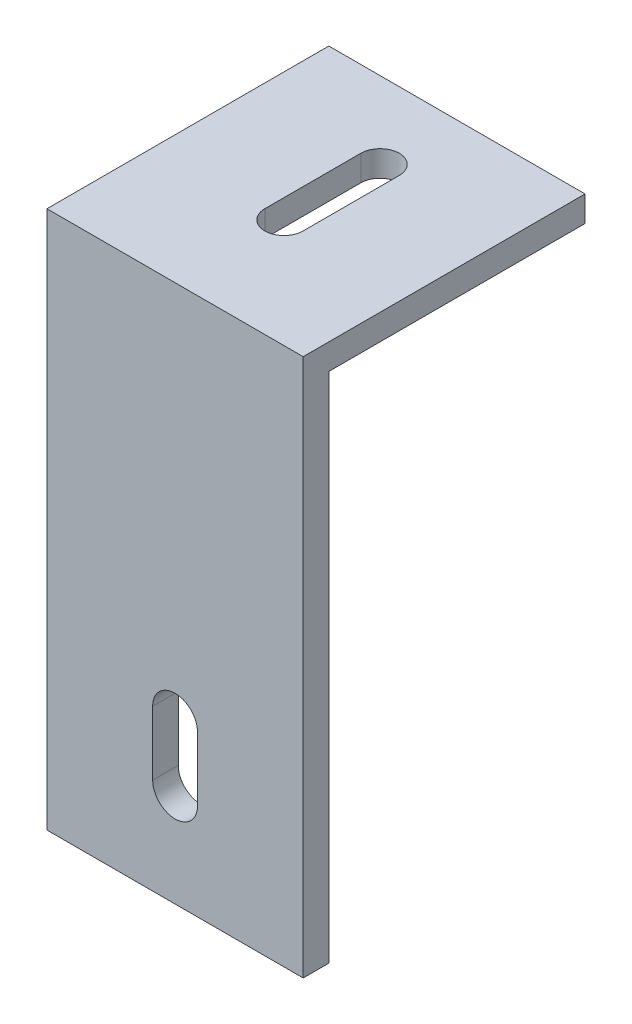
ISO-10303-21;
HEADER;
FILE_DESCRIPTION(('STEP AP214'),'2;1');
FILE_NAME('part.step','',(''),(''),'','','');
FILE_SCHEMA(('AUTOMOTIVE_DESIGN { 1 0 10303 214 1 1 1 1 }'));
ENDSEC;
DATA;
#1=APPLICATION_CONTEXT('core data for automotive mechanical design processes');
#2=APPLICATION_PROTOCOL_DEFINITION('international standard','automotive_design',2000,#1);
#3=PRODUCT_CONTEXT('',#1,'mechanical');
#4=PRODUCT('Part','Part','',(#3));
#5=PRODUCT_RELATED_PRODUCT_CATEGORY('part','',(#4));
#6=PRODUCT_DEFINITION_FORMATION('','',#4);
#7=PRODUCT_DEFINITION_CONTEXT('part definition',#1,'design');
#8=PRODUCT_DEFINITION('design','',#6,#7);
#9=PRODUCT_DEFINITION_SHAPE('','',#8);
#10=(LENGTH_UNIT() NAMED_UNIT(*) SI_UNIT(.MILLI.,.METRE.));
#11=(NAMED_UNIT(*) PLANE_ANGLE_UNIT() SI_UNIT($,.RADIAN.));
#12=(NAMED_UNIT(*) SI_UNIT($,.STERADIAN.) SOLID_ANGLE_UNIT());
#13=UNCERTAINTY_MEASURE_WITH_UNIT(LENGTH_MEASURE(1.E-05),#10,'distance_accuracy_value','');
#14=(GEOMETRIC_REPRESENTATION_CONTEXT(3) GLOBAL_UNCERTAINTY_ASSIGNED_CONTEXT((#13)) GLOBAL_UNIT_ASSIGNED_CONTEXT((#10,
#11,#12)) REPRESENTATION_CONTEXT('',''));
#15=CARTESIAN_POINT('',(0.,0.,0.));
#16=DIRECTION('',(0.,0.,1.));
#17=DIRECTION('',(1.,0.,0.));
#18=AXIS2_PLACEMENT_3D('',#15,#16,#17);
#19=CARTESIAN_POINT('',(40.,0.,-4.00000000000001));
#20=DIRECTION('',(0.,1.,0.));
#21=DIRECTION('',(0.,0.,1.));
#22=AXIS2_PLACEMENT_3D('',#19,#20,#21);
#23=PLANE('',#22);
#24=DIRECTION('',(0.,0.,-1.));
#25=VECTOR('',#24,1.);
#26=CARTESIAN_POINT('',(0.,0.,-4.00000000000001));
#27=LINE('',#26,#25);
#28=CARTESIAN_POINT('',(0.,0.,0.));
#29=VERTEX_POINT('',#28);
#30=CARTESIAN_POINT('',(0.,0.,-4.00000000000001));
#31=VERTEX_POINT('',#30);
#32=EDGE_CURVE('E234',#29,#31,#27,.T.);
#33=ORIENTED_EDGE('',*,*,#32,.T.);
#34=DIRECTION('',(-1.,0.,0.));
#35=VECTOR('',#34,1.);
#36=CARTESIAN_POINT('',(40.,0.,-4.00000000000001));
#37=LINE('',#36,#35);
#38=CARTESIAN_POINT('',(40.,0.,-4.00000000000001));
#39=VERTEX_POINT('',#38);
#40=EDGE_CURVE('E11',#39,#31,#37,.T.);
#41=ORIENTED_EDGE('',*,*,#40,.F.);
#42=DIRECTION('',(0.,0.,-1.));
#43=VECTOR('',#42,1.);
#44=CARTESIAN_POINT('',(40.,0.,-4.00000000000001));
#45=LINE('',#44,#43);
#46=CARTESIAN_POINT('',(40.,0.,0.));
#47=VERTEX_POINT('',#46);
#48=EDGE_CURVE('E235',#47,#39,#45,.T.);
#49=ORIENTED_EDGE('',*,*,#48,.F.);
#50=DIRECTION('',(-1.,0.,0.));
#51=VECTOR('',#50,1.);
#52=CARTESIAN_POINT('',(40.,0.,0.));
#53=LINE('',#52,#51);
#54=EDGE_CURVE('E255',#47,#29,#53,.T.);
#55=ORIENTED_EDGE('',*,*,#54,.T.);
#56=EDGE_LOOP('',(#33,#41,#49,#55));
#57=FACE_BOUND('',#56,.T.);
#58=ADVANCED_FACE('F43',(#57),#23,.F.);
#59=CARTESIAN_POINT('',(40.,80.,-4.));
#60=DIRECTION('',(0.,0.,1.));
#61=DIRECTION('',(0.,-1.,0.));
#62=AXIS2_PLACEMENT_3D('',#59,#60,#61);
#63=PLANE('',#62);
#64=DIRECTION('',(0.,1.,0.));
#65=VECTOR('',#64,1.);
#66=CARTESIAN_POINT('',(16.5,25.,-4.00000000000001));
#67=LINE('',#66,#65);
#68=CARTESIAN_POINT('',(16.5,15.,-4.00000000000001));
#69=VERTEX_POINT('',#68);
#70=CARTESIAN_POINT('',(16.5,25.,-4.00000000000001));
#71=VERTEX_POINT('',#70);
#72=EDGE_CURVE('E166',#69,#71,#67,.T.);
#73=ORIENTED_EDGE('',*,*,#72,.F.);
#74=CARTESIAN_POINT('',(20.,15.,-4.00000000000001));
#75=DIRECTION('',(0.,0.,1.));
#76=DIRECTION('',(0.,-1.,0.));
#77=AXIS2_PLACEMENT_3D('',#74,#75,#76);
#78=CIRCLE('',#77,3.5);
#79=CARTESIAN_POINT('',(23.5,15.,-4.00000000000001));
#80=VERTEX_POINT('',#79);
#81=EDGE_CURVE('E146',#80,#69,#78,.F.);
#82=ORIENTED_EDGE('',*,*,#81,.F.);
#83=DIRECTION('',(0.,-1.,0.));
#84=VECTOR('',#83,1.);
#85=CARTESIAN_POINT('',(23.5,15.,-4.00000000000001));
#86=LINE('',#85,#84);
#87=CARTESIAN_POINT('',(23.5,25.,-4.00000000000001));
#88=VERTEX_POINT('',#87);
#89=EDGE_CURVE('E156',#88,#80,#86,.T.);
#90=ORIENTED_EDGE('',*,*,#89,.F.);
#91=CARTESIAN_POINT('',(20.,25.,-4.00000000000001));
#92=DIRECTION('',(0.,0.,1.));
#93=DIRECTION('',(0.,-1.,0.));
#94=AXIS2_PLACEMENT_3D('',#91,#92,#93);
#95=CIRCLE('',#94,3.5);
#96=EDGE_CURVE('E58',#71,#88,#95,.F.);
#97=ORIENTED_EDGE('',*,*,#96,.F.);
#98=EDGE_LOOP('',(#73,#82,#90,#97));
#99=FACE_BOUND('',#98,.T.);
#100=DIRECTION('',(0.,1.,0.));
#101=VECTOR('',#100,1.);
#102=CARTESIAN_POINT('',(0.,80.,-4.));
#103=LINE('',#102,#101);
#104=CARTESIAN_POINT('',(0.,80.,-4.));
#105=VERTEX_POINT('',#104);
#106=EDGE_CURVE('E259',#31,#105,#103,.T.);
#107=ORIENTED_EDGE('',*,*,#106,.T.);
#108=DIRECTION('',(-1.,0.,0.));
#109=VECTOR('',#108,1.);
#110=CARTESIAN_POINT('',(40.,80.,-4.));
#111=LINE('',#110,#109);
#112=CARTESIAN_POINT('',(40.,80.,-4.));
#113=VERTEX_POINT('',#112);
#114=EDGE_CURVE('E51',#113,#105,#111,.T.);
#115=ORIENTED_EDGE('',*,*,#114,.F.);
#116=DIRECTION('',(0.,1.,0.));
#117=VECTOR('',#116,1.);
#118=CARTESIAN_POINT('',(40.,80.,-4.));
#119=LINE('',#118,#117);
#120=EDGE_CURVE('E239',#39,#113,#119,.T.);
#121=ORIENTED_EDGE('',*,*,#120,.F.);
#122=ORIENTED_EDGE('',*,*,#40,.T.);
#123=EDGE_LOOP('',(#107,#115,#121,#122));
#124=FACE_BOUND('',#123,.T.);
#125=ADVANCED_FACE('F163',(#99,#124),#63,.F.);
#126=CARTESIAN_POINT('',(40.,80.,-44.));
#127=DIRECTION('',(0.,1.,0.));
#128=DIRECTION('',(0.,0.,1.));
#129=AXIS2_PLACEMENT_3D('',#126,#127,#128);
#130=PLANE('',#129);
#131=DIRECTION('',(0.,0.,1.));
#132=VECTOR('',#131,1.);
#133=CARTESIAN_POINT('',(23.,80.,-17.));
#134=LINE('',#133,#132);
#135=CARTESIAN_POINT('',(23.,80.,-32.));
#136=VERTEX_POINT('',#135);
#137=CARTESIAN_POINT('',(23.,80.,-17.));
#138=VERTEX_POINT('',#137);
#139=EDGE_CURVE('E194',#136,#138,#134,.T.);
#140=ORIENTED_EDGE('',*,*,#139,.F.);
#141=CARTESIAN_POINT('',(20.,80.,-32.));
#142=DIRECTION('',(0.,1.,0.));
#143=DIRECTION('',(0.,0.,1.));
#144=AXIS2_PLACEMENT_3D('',#141,#142,#143);
#145=CIRCLE('',#144,3.);
#146=CARTESIAN_POINT('',(17.,80.,-32.));
#147=VERTEX_POINT('',#146);
#148=EDGE_CURVE('E198',#147,#136,#145,.F.);
#149=ORIENTED_EDGE('',*,*,#148,.F.);
#150=DIRECTION('',(0.,0.,-1.));
#151=VECTOR('',#150,1.);
#152=CARTESIAN_POINT('',(17.,80.,-32.));
#153=LINE('',#152,#151);
#154=CARTESIAN_POINT('',(17.,80.,-17.));
#155=VERTEX_POINT('',#154);
#156=EDGE_CURVE('E221',#155,#147,#153,.T.);
#157=ORIENTED_EDGE('',*,*,#156,.F.);
#158=CARTESIAN_POINT('',(20.,80.,-17.));
#159=DIRECTION('',(0.,1.,0.));
#160=DIRECTION('',(0.,0.,1.));
#161=AXIS2_PLACEMENT_3D('',#158,#159,#160);
#162=CIRCLE('',#161,3.);
#163=EDGE_CURVE('E160',#138,#155,#162,.F.);
#164=ORIENTED_EDGE('',*,*,#163,.F.);
#165=EDGE_LOOP('',(#140,#149,#157,#164));
#166=FACE_BOUND('',#165,.T.);
#167=DIRECTION('',(0.,0.,-1.));
#168=VECTOR('',#167,1.);
#169=CARTESIAN_POINT('',(0.,80.,-44.));
#170=LINE('',#169,#168);
#171=CARTESIAN_POINT('',(0.,80.,-44.));
#172=VERTEX_POINT('',#171);
#173=EDGE_CURVE('E262',#105,#172,#170,.T.);
#174=ORIENTED_EDGE('',*,*,#173,.T.);
#175=DIRECTION('',(-1.,0.,0.));
#176=VECTOR('',#175,1.);
#177=CARTESIAN_POINT('',(40.,80.,-44.));
#178=LINE('',#177,#176);
#179=CARTESIAN_POINT('',(40.,80.,-44.));
#180=VERTEX_POINT('',#179);
#181=EDGE_CURVE('E284',#180,#172,#178,.T.);
#182=ORIENTED_EDGE('',*,*,#181,.F.);
#183=DIRECTION('',(0.,0.,-1.));
#184=VECTOR('',#183,1.);
#185=CARTESIAN_POINT('',(40.,80.,-44.));
#186=LINE('',#185,#184);
#187=EDGE_CURVE('E243',#113,#180,#186,.T.);
#188=ORIENTED_EDGE('',*,*,#187,.F.);
#189=ORIENTED_EDGE('',*,*,#114,.T.);
#190=EDGE_LOOP('',(#174,#182,#188,#189));
#191=FACE_BOUND('',#190,.T.);
#192=ADVANCED_FACE('F293',(#166,#191),#130,.F.);
#193=CARTESIAN_POINT('',(40.,84.,-44.));
#194=DIRECTION('',(0.,0.,1.));
#195=DIRECTION('',(1.,0.,0.));
#196=AXIS2_PLACEMENT_3D('',#193,#194,#195);
#197=PLANE('',#196);
#198=DIRECTION('',(0.,1.,0.));
#199=VECTOR('',#198,1.);
#200=CARTESIAN_POINT('',(0.,84.,-44.));
#201=LINE('',#200,#199);
#202=CARTESIAN_POINT('',(0.,84.,-44.));
#203=VERTEX_POINT('',#202);
#204=EDGE_CURVE('E265',#172,#203,#201,.T.);
#205=ORIENTED_EDGE('',*,*,#204,.T.);
#206=DIRECTION('',(-1.,0.,0.));
#207=VECTOR('',#206,1.);
#208=CARTESIAN_POINT('',(40.,84.,-44.));
#209=LINE('',#208,#207);
#210=CARTESIAN_POINT('',(40.,84.,-44.));
#211=VERTEX_POINT('',#210);
#212=EDGE_CURVE('E280',#211,#203,#209,.T.);
#213=ORIENTED_EDGE('',*,*,#212,.F.);
#214=DIRECTION('',(0.,1.,0.));
#215=VECTOR('',#214,1.);
#216=CARTESIAN_POINT('',(40.,84.,-44.));
#217=LINE('',#216,#215);
#218=EDGE_CURVE('E246',#180,#211,#217,.T.);
#219=ORIENTED_EDGE('',*,*,#218,.F.);
#220=ORIENTED_EDGE('',*,*,#181,.T.);
#221=EDGE_LOOP('',(#205,#213,#219,#220));
#222=FACE_BOUND('',#221,.T.);
#223=ADVANCED_FACE('F303',(#222),#197,.F.);
#224=CARTESIAN_POINT('',(40.,84.,0.));
#225=DIRECTION('',(0.,-1.,0.));
#226=DIRECTION('',(0.,0.,-1.));
#227=AXIS2_PLACEMENT_3D('',#224,#225,#226);
#228=PLANE('',#227);
#229=DIRECTION('',(0.,0.,1.));
#230=VECTOR('',#229,1.);
#231=CARTESIAN_POINT('',(17.,84.,-32.));
#232=LINE('',#231,#230);
#233=CARTESIAN_POINT('',(17.,84.,-32.));
#234=VERTEX_POINT('',#233);
#235=CARTESIAN_POINT('',(17.,84.,-17.));
#236=VERTEX_POINT('',#235);
#237=EDGE_CURVE('E205',#234,#236,#232,.T.);
#238=ORIENTED_EDGE('',*,*,#237,.F.);
#239=CARTESIAN_POINT('',(20.,84.,-32.));
#240=DIRECTION('',(0.,1.,0.));
#241=DIRECTION('',(0.,0.,1.));
#242=AXIS2_PLACEMENT_3D('',#239,#240,#241);
#243=CIRCLE('',#242,3.);
#244=CARTESIAN_POINT('',(23.,84.,-32.));
#245=VERTEX_POINT('',#244);
#246=EDGE_CURVE('E202',#245,#234,#243,.T.);
#247=ORIENTED_EDGE('',*,*,#246,.F.);
#248=DIRECTION('',(0.,0.,-1.));
#249=VECTOR('',#248,1.);
#250=CARTESIAN_POINT('',(23.,84.,-17.));
#251=LINE('',#250,#249);
#252=CARTESIAN_POINT('',(23.,84.,-17.));
#253=VERTEX_POINT('',#252);
#254=EDGE_CURVE('E213',#253,#245,#251,.T.);
#255=ORIENTED_EDGE('',*,*,#254,.F.);
#256=CARTESIAN_POINT('',(20.,84.,-17.));
#257=DIRECTION('',(0.,1.,0.));
#258=DIRECTION('',(0.,0.,1.));
#259=AXIS2_PLACEMENT_3D('',#256,#257,#258);
#260=CIRCLE('',#259,3.);
#261=EDGE_CURVE('E209',#236,#253,#260,.T.);
#262=ORIENTED_EDGE('',*,*,#261,.F.);
#263=EDGE_LOOP('',(#238,#247,#255,#262));
#264=FACE_BOUND('',#263,.T.);
#265=DIRECTION('',(0.,0.,1.));
#266=VECTOR('',#265,1.);
#267=CARTESIAN_POINT('',(0.,84.,0.));
#268=LINE('',#267,#266);
#269=CARTESIAN_POINT('',(0.,84.,0.));
#270=VERTEX_POINT('',#269);
#271=EDGE_CURVE('E268',#203,#270,#268,.T.);
#272=ORIENTED_EDGE('',*,*,#271,.T.);
#273=DIRECTION('',(-1.,0.,0.));
#274=VECTOR('',#273,1.);
#275=CARTESIAN_POINT('',(40.,84.,0.));
#276=LINE('',#275,#274);
#277=CARTESIAN_POINT('',(40.,84.,0.));
#278=VERTEX_POINT('',#277);
#279=EDGE_CURVE('E276',#278,#270,#276,.T.);
#280=ORIENTED_EDGE('',*,*,#279,.F.);
#281=DIRECTION('',(0.,0.,1.));
#282=VECTOR('',#281,1.);
#283=CARTESIAN_POINT('',(40.,84.,0.));
#284=LINE('',#283,#282);
#285=EDGE_CURVE('E249',#211,#278,#284,.T.);
#286=ORIENTED_EDGE('',*,*,#285,.F.);
#287=ORIENTED_EDGE('',*,*,#212,.T.);
#288=EDGE_LOOP('',(#272,#280,#286,#287));
#289=FACE_BOUND('',#288,.T.);
#290=ADVANCED_FACE('F307',(#264,#289),#228,.F.);
#291=CARTESIAN_POINT('',(40.,0.,0.));
#292=DIRECTION('',(0.,0.,-1.));
#293=DIRECTION('',(-1.,0.,0.));
#294=AXIS2_PLACEMENT_3D('',#291,#292,#293);
#295=PLANE('',#294);
#296=DIRECTION('',(0.,1.,0.));
#297=VECTOR('',#296,1.);
#298=CARTESIAN_POINT('',(23.5,15.,0.));
#299=LINE('',#298,#297);
#300=CARTESIAN_POINT('',(23.5,15.,0.));
#301=VERTEX_POINT('',#300);
#302=CARTESIAN_POINT('',(23.5,25.,0.));
#303=VERTEX_POINT('',#302);
#304=EDGE_CURVE('E171',#301,#303,#299,.T.);
#305=ORIENTED_EDGE('',*,*,#304,.F.);
#306=CARTESIAN_POINT('',(20.,15.,0.));
#307=DIRECTION('',(0.,0.,1.));
#308=DIRECTION('',(1.,0.,0.));
#309=AXIS2_PLACEMENT_3D('',#306,#307,#308);
#310=CIRCLE('',#309,3.5);
#311=CARTESIAN_POINT('',(16.5,15.,0.));
#312=VERTEX_POINT('',#311);
#313=EDGE_CURVE('E66',#312,#301,#310,.T.);
#314=ORIENTED_EDGE('',*,*,#313,.F.);
#315=DIRECTION('',(0.,-1.,0.));
#316=VECTOR('',#315,1.);
#317=CARTESIAN_POINT('',(16.5,25.,0.));
#318=LINE('',#317,#316);
#319=CARTESIAN_POINT('',(16.5,25.,0.));
#320=VERTEX_POINT('',#319);
#321=EDGE_CURVE('E153',#320,#312,#318,.T.);
#322=ORIENTED_EDGE('',*,*,#321,.F.);
#323=CARTESIAN_POINT('',(20.,25.,0.));
#324=DIRECTION('',(0.,0.,1.));
#325=DIRECTION('',(1.,0.,0.));
#326=AXIS2_PLACEMENT_3D('',#323,#324,#325);
#327=CIRCLE('',#326,3.5);
#328=EDGE_CURVE('E178',#303,#320,#327,.T.);
#329=ORIENTED_EDGE('',*,*,#328,.F.);
#330=EDGE_LOOP('',(#305,#314,#322,#329));
#331=FACE_BOUND('',#330,.T.);
#332=DIRECTION('',(0.,-1.,0.));
#333=VECTOR('',#332,1.);
#334=CARTESIAN_POINT('',(0.,0.,0.));
#335=LINE('',#334,#333);
#336=EDGE_CURVE('E240',#270,#29,#335,.T.);
#337=ORIENTED_EDGE('',*,*,#336,.T.);
#338=ORIENTED_EDGE('',*,*,#54,.F.);
#339=DIRECTION('',(0.,-1.,0.));
#340=VECTOR('',#339,1.);
#341=CARTESIAN_POINT('',(40.,0.,0.));
#342=LINE('',#341,#340);
#343=EDGE_CURVE('E252',#278,#47,#342,.T.);
#344=ORIENTED_EDGE('',*,*,#343,.F.);
#345=ORIENTED_EDGE('',*,*,#279,.T.);
#346=EDGE_LOOP('',(#337,#338,#344,#345));
#347=FACE_BOUND('',#346,.T.);
#348=ADVANCED_FACE('F317',(#331,#347),#295,.F.);
#349=CARTESIAN_POINT('',(40.,0.,0.));
#350=DIRECTION('',(-1.,0.,0.));
#351=DIRECTION('',(0.,0.,1.));
#352=AXIS2_PLACEMENT_3D('',#349,#350,#351);
#353=PLANE('',#352);
#354=ORIENTED_EDGE('',*,*,#48,.T.);
#355=ORIENTED_EDGE('',*,*,#120,.T.);
#356=ORIENTED_EDGE('',*,*,#187,.T.);
#357=ORIENTED_EDGE('',*,*,#218,.T.);
#358=ORIENTED_EDGE('',*,*,#285,.T.);
#359=ORIENTED_EDGE('',*,*,#343,.T.);
#360=EDGE_LOOP('',(#354,#355,#356,#357,#358,#359));
#361=FACE_BOUND('',#360,.T.);
#362=ADVANCED_FACE('F311',(#361),#353,.F.);
#363=CARTESIAN_POINT('',(0.,0.,0.));
#364=DIRECTION('',(-1.,0.,0.));
#365=DIRECTION('',(0.,0.,1.));
#366=AXIS2_PLACEMENT_3D('',#363,#364,#365);
#367=PLANE('',#366);
#368=ORIENTED_EDGE('',*,*,#32,.F.);
#369=ORIENTED_EDGE('',*,*,#336,.F.);
#370=ORIENTED_EDGE('',*,*,#271,.F.);
#371=ORIENTED_EDGE('',*,*,#204,.F.);
#372=ORIENTED_EDGE('',*,*,#173,.F.);
#373=ORIENTED_EDGE('',*,*,#106,.F.);
#374=EDGE_LOOP('',(#368,#369,#370,#371,#372,#373));
#375=FACE_BOUND('',#374,.T.);
#376=ADVANCED_FACE('F298',(#375),#367,.T.);
#377=CARTESIAN_POINT('',(20.,-0.001000000000001,-32.));
#378=DIRECTION('',(0.,1.,0.));
#379=DIRECTION('',(0.,0.,1.));
#380=AXIS2_PLACEMENT_3D('',#377,#378,#379);
#381=CYLINDRICAL_SURFACE('',#380,3.);
#382=ORIENTED_EDGE('',*,*,#148,.T.);
#383=DIRECTION('',(0.,1.,0.));
#384=VECTOR('',#383,1.);
#385=CARTESIAN_POINT('',(23.,-0.001000000000001,-32.));
#386=LINE('',#385,#384);
#387=EDGE_CURVE('E218',#136,#245,#386,.T.);
#388=ORIENTED_EDGE('',*,*,#387,.T.);
#389=ORIENTED_EDGE('',*,*,#246,.T.);
#390=DIRECTION('',(0.,1.,0.));
#391=VECTOR('',#390,1.);
#392=CARTESIAN_POINT('',(17.,-0.001000000000001,-32.));
#393=LINE('',#392,#391);
#394=EDGE_CURVE('E217',#147,#234,#393,.T.);
#395=ORIENTED_EDGE('',*,*,#394,.F.);
#396=EDGE_LOOP('',(#382,#388,#389,#395));
#397=FACE_BOUND('',#396,.T.);
#398=ADVANCED_FACE('F359',(#397),#381,.F.);
#399=CARTESIAN_POINT('',(23.,-0.001000000000001,-17.));
#400=DIRECTION('',(1.,0.,0.));
#401=DIRECTION('',(0.,0.,-1.));
#402=AXIS2_PLACEMENT_3D('',#399,#400,#401);
#403=PLANE('',#402);
#404=ORIENTED_EDGE('',*,*,#139,.T.);
#405=DIRECTION('',(0.,1.,0.));
#406=VECTOR('',#405,1.);
#407=CARTESIAN_POINT('',(23.,-0.001000000000001,-17.));
#408=LINE('',#407,#406);
#409=EDGE_CURVE('E222',#138,#253,#408,.T.);
#410=ORIENTED_EDGE('',*,*,#409,.T.);
#411=ORIENTED_EDGE('',*,*,#254,.T.);
#412=ORIENTED_EDGE('',*,*,#387,.F.);
#413=EDGE_LOOP('',(#404,#410,#411,#412));
#414=FACE_BOUND('',#413,.T.);
#415=ADVANCED_FACE('F364',(#414),#403,.F.);
#416=CARTESIAN_POINT('',(20.,-0.001000000000001,-17.));
#417=DIRECTION('',(0.,1.,0.));
#418=DIRECTION('',(0.,0.,1.));
#419=AXIS2_PLACEMENT_3D('',#416,#417,#418);
#420=CYLINDRICAL_SURFACE('',#419,3.);
#421=ORIENTED_EDGE('',*,*,#163,.T.);
#422=DIRECTION('',(0.,1.,0.));
#423=VECTOR('',#422,1.);
#424=CARTESIAN_POINT('',(17.,-0.001000000000001,-17.));
#425=LINE('',#424,#423);
#426=EDGE_CURVE('E225',#155,#236,#425,.T.);
#427=ORIENTED_EDGE('',*,*,#426,.T.);
#428=ORIENTED_EDGE('',*,*,#261,.T.);
#429=ORIENTED_EDGE('',*,*,#409,.F.);
#430=EDGE_LOOP('',(#421,#427,#428,#429));
#431=FACE_BOUND('',#430,.T.);
#432=ADVANCED_FACE('F377',(#431),#420,.F.);
#433=CARTESIAN_POINT('',(17.,-0.001000000000001,-32.));
#434=DIRECTION('',(-1.,0.,0.));
#435=DIRECTION('',(0.,0.,1.));
#436=AXIS2_PLACEMENT_3D('',#433,#434,#435);
#437=PLANE('',#436);
#438=ORIENTED_EDGE('',*,*,#156,.T.);
#439=ORIENTED_EDGE('',*,*,#394,.T.);
#440=ORIENTED_EDGE('',*,*,#237,.T.);
#441=ORIENTED_EDGE('',*,*,#426,.F.);
#442=EDGE_LOOP('',(#438,#439,#440,#441));
#443=FACE_BOUND('',#442,.T.);
#444=ADVANCED_FACE('F388',(#443),#437,.F.);
#445=CARTESIAN_POINT('',(20.,15.,-44.001));
#446=DIRECTION('',(0.,0.,1.));
#447=DIRECTION('',(1.,0.,0.));
#448=AXIS2_PLACEMENT_3D('',#445,#446,#447);
#449=CYLINDRICAL_SURFACE('',#448,3.5);
#450=ORIENTED_EDGE('',*,*,#81,.T.);
#451=DIRECTION('',(0.,0.,1.));
#452=VECTOR('',#451,1.);
#453=CARTESIAN_POINT('',(16.5,15.,-44.001));
#454=LINE('',#453,#452);
#455=EDGE_CURVE('E161',#69,#312,#454,.T.);
#456=ORIENTED_EDGE('',*,*,#455,.T.);
#457=ORIENTED_EDGE('',*,*,#313,.T.);
#458=DIRECTION('',(0.,0.,1.));
#459=VECTOR('',#458,1.);
#460=CARTESIAN_POINT('',(23.5,15.,-44.001));
#461=LINE('',#460,#459);
#462=EDGE_CURVE('E142',#80,#301,#461,.T.);
#463=ORIENTED_EDGE('',*,*,#462,.F.);
#464=EDGE_LOOP('',(#450,#456,#457,#463));
#465=FACE_BOUND('',#464,.T.);
#466=ADVANCED_FACE('F144',(#465),#449,.F.);
#467=CARTESIAN_POINT('',(16.5,25.,-44.001));
#468=DIRECTION('',(-1.,0.,0.));
#469=DIRECTION('',(0.,-1.,0.));
#470=AXIS2_PLACEMENT_3D('',#467,#468,#469);
#471=PLANE('',#470);
#472=ORIENTED_EDGE('',*,*,#72,.T.);
#473=DIRECTION('',(0.,0.,1.));
#474=VECTOR('',#473,1.);
#475=CARTESIAN_POINT('',(16.5,25.,-44.001));
#476=LINE('',#475,#474);
#477=EDGE_CURVE('E187',#71,#320,#476,.T.);
#478=ORIENTED_EDGE('',*,*,#477,.T.);
#479=ORIENTED_EDGE('',*,*,#321,.T.);
#480=ORIENTED_EDGE('',*,*,#455,.F.);
#481=EDGE_LOOP('',(#472,#478,#479,#480));
#482=FACE_BOUND('',#481,.T.);
#483=ADVANCED_FACE('F420',(#482),#471,.F.);
#484=CARTESIAN_POINT('',(20.,25.,-44.001));
#485=DIRECTION('',(0.,0.,1.));
#486=DIRECTION('',(1.,0.,0.));
#487=AXIS2_PLACEMENT_3D('',#484,#485,#486);
#488=CYLINDRICAL_SURFACE('',#487,3.5);
#489=ORIENTED_EDGE('',*,*,#96,.T.);
#490=DIRECTION('',(0.,0.,1.));
#491=VECTOR('',#490,1.);
#492=CARTESIAN_POINT('',(23.5,25.,-44.001));
#493=LINE('',#492,#491);
#494=EDGE_CURVE('E152',#88,#303,#493,.T.);
#495=ORIENTED_EDGE('',*,*,#494,.T.);
#496=ORIENTED_EDGE('',*,*,#328,.T.);
#497=ORIENTED_EDGE('',*,*,#477,.F.);
#498=EDGE_LOOP('',(#489,#495,#496,#497));
#499=FACE_BOUND('',#498,.T.);
#500=ADVANCED_FACE('F430',(#499),#488,.F.);
#501=CARTESIAN_POINT('',(23.5,15.,-44.001));
#502=DIRECTION('',(1.,0.,0.));
#503=DIRECTION('',(0.,1.,0.));
#504=AXIS2_PLACEMENT_3D('',#501,#502,#503);
#505=PLANE('',#504);
#506=ORIENTED_EDGE('',*,*,#89,.T.);
#507=ORIENTED_EDGE('',*,*,#462,.T.);
#508=ORIENTED_EDGE('',*,*,#304,.T.);
#509=ORIENTED_EDGE('',*,*,#494,.F.);
#510=EDGE_LOOP('',(#506,#507,#508,#509));
#511=FACE_BOUND('',#510,.T.);
#512=ADVANCED_FACE('F157',(#511),#505,.F.);
#513=CLOSED_SHELL('',(#58,#125,#192,#223,#290,#348,#362,#376,#398,#415,#432,#444,#466,#483,#500,#512));
#514=MANIFOLD_SOLID_BREP('B2',#513);
#515=ADVANCED_BREP_SHAPE_REPRESENTATION('',(#18,#514),#14);
#516=SHAPE_DEFINITION_REPRESENTATION(#9,#515);
ENDSEC;
END-ISO-10303-21;
